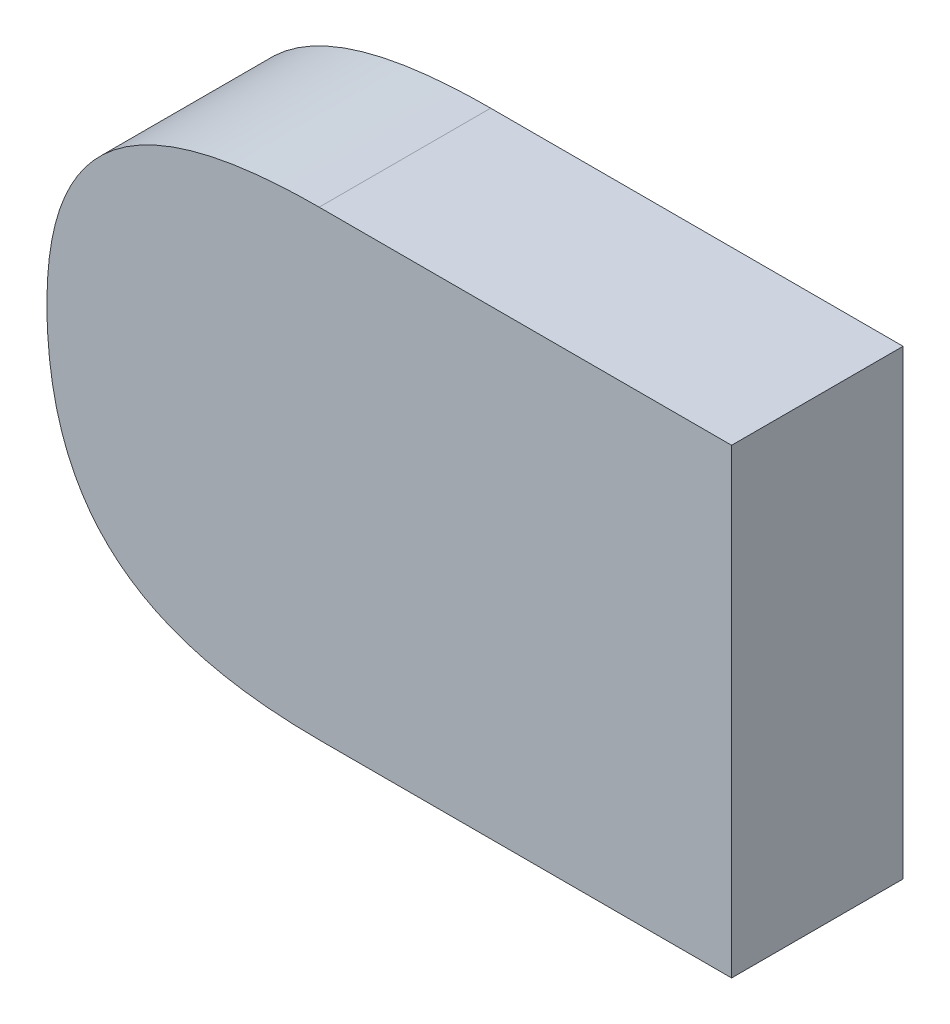
ISO-10303-21;
HEADER;
FILE_DESCRIPTION(('STEP AP214'),'2;1');
FILE_NAME('part.step','',(''),(''),'','','');
FILE_SCHEMA(('AUTOMOTIVE_DESIGN { 1 0 10303 214 1 1 1 1 }'));
ENDSEC;
DATA;
#1=APPLICATION_CONTEXT('core data for automotive mechanical design processes');
#2=APPLICATION_PROTOCOL_DEFINITION('international standard','automotive_design',2000,#1);
#3=PRODUCT_CONTEXT('',#1,'mechanical');
#4=PRODUCT('Part','Part','',(#3));
#5=PRODUCT_RELATED_PRODUCT_CATEGORY('part','',(#4));
#6=PRODUCT_DEFINITION_FORMATION('','',#4);
#7=PRODUCT_DEFINITION_CONTEXT('part definition',#1,'design');
#8=PRODUCT_DEFINITION('design','',#6,#7);
#9=PRODUCT_DEFINITION_SHAPE('','',#8);
#10=(LENGTH_UNIT() NAMED_UNIT(*) SI_UNIT(.MILLI.,.METRE.));
#11=(NAMED_UNIT(*) PLANE_ANGLE_UNIT() SI_UNIT($,.RADIAN.));
#12=(NAMED_UNIT(*) SI_UNIT($,.STERADIAN.) SOLID_ANGLE_UNIT());
#13=UNCERTAINTY_MEASURE_WITH_UNIT(LENGTH_MEASURE(1.E-05),#10,'distance_accuracy_value','');
#14=(GEOMETRIC_REPRESENTATION_CONTEXT(3) GLOBAL_UNCERTAINTY_ASSIGNED_CONTEXT((#13)) GLOBAL_UNIT_ASSIGNED_CONTEXT((#10,
#11,#12)) REPRESENTATION_CONTEXT('',''));
#15=CARTESIAN_POINT('',(0.,0.,0.));
#16=DIRECTION('',(0.,0.,1.));
#17=DIRECTION('',(1.,0.,0.));
#18=AXIS2_PLACEMENT_3D('',#15,#16,#17);
#19=CARTESIAN_POINT('',(20.27643797394,0.827911429436,-5.5));
#20=DIRECTION('',(0.,0.,-1.));
#21=DIRECTION('',(-1.,0.,0.));
#22=AXIS2_PLACEMENT_3D('',#19,#20,#21);
#23=PLANE('',#22);
#24=DIRECTION('',(0.,-1.,0.));
#25=VECTOR('',#24,1.);
#26=CARTESIAN_POINT('',(22.18731541969,2.172720249699,-5.5));
#27=LINE('',#26,#25);
#28=CARTESIAN_POINT('',(22.18731541969,2.172720249699,-5.5));
#29=VERTEX_POINT('',#28);
#30=CARTESIAN_POINT('',(22.18731541969,-0.51778603919,-5.5));
#31=VERTEX_POINT('',#30);
#32=EDGE_CURVE('E116',#29,#31,#27,.T.);
#33=ORIENTED_EDGE('',*,*,#32,.F.);
#34=DIRECTION('',(1.,0.,0.));
#35=VECTOR('',#34,1.);
#36=CARTESIAN_POINT('',(19.78230795303,2.172720249699,-5.5));
#37=LINE('',#36,#35);
#38=CARTESIAN_POINT('',(19.78230795303,2.172720249699,-5.5));
#39=VERTEX_POINT('',#38);
#40=EDGE_CURVE('E25',#39,#29,#37,.T.);
#41=ORIENTED_EDGE('',*,*,#40,.F.);
#42=CARTESIAN_POINT('',(18.19457935303,0.89513976081,-5.5));
#43=CARTESIAN_POINT('',(18.19457935303,1.710152383032,-5.5));
#44=CARTESIAN_POINT('',(18.63086104192,2.172720249699,-5.5));
#45=CARTESIAN_POINT('',(19.78230795303,2.172720249699,-5.5));
#46=(BOUNDED_CURVE() B_SPLINE_CURVE(3,(#42,#43,#44,#45),.UNSPECIFIED.,.F.,
.F.) B_SPLINE_CURVE_WITH_KNOTS((4,4),(0.,1.),
.UNSPECIFIED.) CURVE() GEOMETRIC_REPRESENTATION_ITEM() RATIONAL_B_SPLINE_CURVE((1.,1.,1.,1.)) REPRESENTATION_ITEM(''));
#47=CARTESIAN_POINT('',(18.19457935303,0.89513976081,-5.5));
#48=VERTEX_POINT('',#47);
#49=EDGE_CURVE('E95',#48,#39,#46,.T.);
#50=ORIENTED_EDGE('',*,*,#49,.F.);
#51=CARTESIAN_POINT('',(19.79293079747,-0.51778603919,-5.5));
#52=CARTESIAN_POINT('',(18.80192439747,-0.51778603919,-5.5));
#53=CARTESIAN_POINT('',(18.19457935303,-0.176520105856999,-5.5));
#54=CARTESIAN_POINT('',(18.19457935303,0.89513976081,-5.5));
#55=(BOUNDED_CURVE() B_SPLINE_CURVE(3,(#51,#52,#53,#54),.UNSPECIFIED.,.F.,
.F.) B_SPLINE_CURVE_WITH_KNOTS((4,4),(0.,1.),
.UNSPECIFIED.) CURVE() GEOMETRIC_REPRESENTATION_ITEM() RATIONAL_B_SPLINE_CURVE((1.,1.,1.,1.)) REPRESENTATION_ITEM(''));
#56=CARTESIAN_POINT('',(19.79293079747,-0.51778603919,-5.5));
#57=VERTEX_POINT('',#56);
#58=EDGE_CURVE('E102',#57,#48,#55,.T.);
#59=ORIENTED_EDGE('',*,*,#58,.F.);
#60=DIRECTION('',(-1.,0.,0.));
#61=VECTOR('',#60,1.);
#62=CARTESIAN_POINT('',(22.18731541969,-0.51778603919,-5.5));
#63=LINE('',#62,#61);
#64=EDGE_CURVE('E19',#31,#57,#63,.T.);
#65=ORIENTED_EDGE('',*,*,#64,.F.);
#66=EDGE_LOOP('',(#33,#41,#50,#59,#65));
#67=FACE_BOUND('',#66,.T.);
#68=ADVANCED_FACE('F16',(#67),#23,.F.);
#69=CARTESIAN_POINT('',(20.27643797394,0.827911429436,-6.5));
#70=DIRECTION('',(0.,0.,-1.));
#71=DIRECTION('',(-1.,0.,0.));
#72=AXIS2_PLACEMENT_3D('',#69,#70,#71);
#73=PLANE('',#72);
#74=DIRECTION('',(0.,-1.,0.));
#75=VECTOR('',#74,1.);
#76=CARTESIAN_POINT('',(22.18731541969,2.172720249699,-6.5));
#77=LINE('',#76,#75);
#78=CARTESIAN_POINT('',(22.18731541969,2.172720249699,-6.5));
#79=VERTEX_POINT('',#78);
#80=CARTESIAN_POINT('',(22.18731541969,-0.51778603919,-6.5));
#81=VERTEX_POINT('',#80);
#82=EDGE_CURVE('E99',#79,#81,#77,.T.);
#83=ORIENTED_EDGE('',*,*,#82,.T.);
#84=DIRECTION('',(-1.,0.,0.));
#85=VECTOR('',#84,1.);
#86=CARTESIAN_POINT('',(22.18731541969,-0.51778603919,-6.5));
#87=LINE('',#86,#85);
#88=CARTESIAN_POINT('',(19.79293079747,-0.51778603919,-6.5));
#89=VERTEX_POINT('',#88);
#90=EDGE_CURVE('E62',#81,#89,#87,.T.);
#91=ORIENTED_EDGE('',*,*,#90,.T.);
#92=CARTESIAN_POINT('',(19.79293079747,-0.51778603919,-6.5));
#93=CARTESIAN_POINT('',(18.80192439747,-0.51778603919,-6.5));
#94=CARTESIAN_POINT('',(18.19457935303,-0.176520105856999,-6.5));
#95=CARTESIAN_POINT('',(18.19457935303,0.89513976081,-6.5));
#96=(BOUNDED_CURVE() B_SPLINE_CURVE(3,(#92,#93,#94,#95),.UNSPECIFIED.,.F.,
.F.) B_SPLINE_CURVE_WITH_KNOTS((4,4),(0.,1.),
.UNSPECIFIED.) CURVE() GEOMETRIC_REPRESENTATION_ITEM() RATIONAL_B_SPLINE_CURVE((1.,1.,1.,1.)) REPRESENTATION_ITEM(''));
#97=CARTESIAN_POINT('',(18.19457935303,0.89513976081,-6.5));
#98=VERTEX_POINT('',#97);
#99=EDGE_CURVE('E87',#89,#98,#96,.T.);
#100=ORIENTED_EDGE('',*,*,#99,.T.);
#101=CARTESIAN_POINT('',(18.19457935303,0.89513976081,-6.5));
#102=CARTESIAN_POINT('',(18.19457935303,1.710152383032,-6.5));
#103=CARTESIAN_POINT('',(18.63086104192,2.172720249699,-6.5));
#104=CARTESIAN_POINT('',(19.78230795303,2.172720249699,-6.5));
#105=(BOUNDED_CURVE() B_SPLINE_CURVE(3,(#101,#102,#103,#104),.UNSPECIFIED.,.F.,
.F.) B_SPLINE_CURVE_WITH_KNOTS((4,4),(0.,1.),
.UNSPECIFIED.) CURVE() GEOMETRIC_REPRESENTATION_ITEM() RATIONAL_B_SPLINE_CURVE((1.,1.,1.,1.)) REPRESENTATION_ITEM(''));
#106=CARTESIAN_POINT('',(19.78230795303,2.172720249699,-6.5));
#107=VERTEX_POINT('',#106);
#108=EDGE_CURVE('E128',#98,#107,#105,.T.);
#109=ORIENTED_EDGE('',*,*,#108,.T.);
#110=DIRECTION('',(1.,0.,0.));
#111=VECTOR('',#110,1.);
#112=CARTESIAN_POINT('',(19.78230795303,2.172720249699,-6.5));
#113=LINE('',#112,#111);
#114=EDGE_CURVE('E11',#107,#79,#113,.T.);
#115=ORIENTED_EDGE('',*,*,#114,.T.);
#116=EDGE_LOOP('',(#83,#91,#100,#109,#115));
#117=FACE_BOUND('',#116,.T.);
#118=ADVANCED_FACE('F97',(#117),#73,.T.);
#119=CARTESIAN_POINT('',(20.98481168636,2.172720249699,-5.49));
#120=DIRECTION('',(0.,1.,0.));
#121=DIRECTION('',(-1.,0.,0.));
#122=AXIS2_PLACEMENT_3D('',#119,#120,#121);
#123=PLANE('',#122);
#124=DIRECTION('',(0.,0.,1.));
#125=VECTOR('',#124,1.);
#126=CARTESIAN_POINT('',(19.78230795303,2.172720249699,-6.5));
#127=LINE('',#126,#125);
#128=EDGE_CURVE('E131',#107,#39,#127,.T.);
#129=ORIENTED_EDGE('',*,*,#128,.T.);
#130=ORIENTED_EDGE('',*,*,#40,.T.);
#131=DIRECTION('',(0.,0.,1.));
#132=VECTOR('',#131,1.);
#133=CARTESIAN_POINT('',(22.18731541969,2.172720249699,-6.5));
#134=LINE('',#133,#132);
#135=EDGE_CURVE('E119',#79,#29,#134,.T.);
#136=ORIENTED_EDGE('',*,*,#135,.F.);
#137=ORIENTED_EDGE('',*,*,#114,.F.);
#138=EDGE_LOOP('',(#129,#130,#136,#137));
#139=FACE_BOUND('',#138,.T.);
#140=ADVANCED_FACE('F161',(#139),#123,.T.);
#141=CARTESIAN_POINT('',(18.19457935303,0.89513976081,-5.499));
#142=CARTESIAN_POINT('',(18.19457935303,0.89513976081,-6.501));
#143=CARTESIAN_POINT('',(18.19457935303,1.710152383032,-5.499));
#144=CARTESIAN_POINT('',(18.19457935303,1.710152383032,-6.501));
#145=CARTESIAN_POINT('',(18.63086104192,2.172720249699,-5.499));
#146=CARTESIAN_POINT('',(18.63086104192,2.172720249699,-6.501));
#147=CARTESIAN_POINT('',(19.78230795303,2.172720249699,-5.499));
#148=CARTESIAN_POINT('',(19.78230795303,2.172720249699,-6.501));
#149=(BOUNDED_SURFACE() B_SPLINE_SURFACE(3,1,((#141,#142),(#143,#144),(#145,#146),(#147,#148)),
.UNSPECIFIED.,.F.,.F.,.F.) B_SPLINE_SURFACE_WITH_KNOTS((4,4),(2,2),(0.,1.),(-1.001,0.001),
.UNSPECIFIED.) GEOMETRIC_REPRESENTATION_ITEM() RATIONAL_B_SPLINE_SURFACE(((1.,1.),(1.,1.),(1.,
1.),(1.,1.))) REPRESENTATION_ITEM('') SURFACE());
#150=DIRECTION('',(0.,0.,1.));
#151=VECTOR('',#150,1.);
#152=CARTESIAN_POINT('',(18.19457935303,0.89513976081,-6.5));
#153=LINE('',#152,#151);
#154=EDGE_CURVE('E92',#98,#48,#153,.T.);
#155=ORIENTED_EDGE('',*,*,#154,.T.);
#156=ORIENTED_EDGE('',*,*,#49,.T.);
#157=ORIENTED_EDGE('',*,*,#128,.F.);
#158=ORIENTED_EDGE('',*,*,#108,.F.);
#159=EDGE_LOOP('',(#155,#156,#157,#158));
#160=FACE_BOUND('',#159,.T.);
#161=ADVANCED_FACE('F157',(#160),#149,.T.);
#162=CARTESIAN_POINT('',(19.79293079747,-0.51778603919,-5.499));
#163=CARTESIAN_POINT('',(19.79293079747,-0.51778603919,-6.501));
#164=CARTESIAN_POINT('',(18.80192439747,-0.51778603919,-5.499));
#165=CARTESIAN_POINT('',(18.80192439747,-0.51778603919,-6.501));
#166=CARTESIAN_POINT('',(18.19457935303,-0.176520105856999,-5.499));
#167=CARTESIAN_POINT('',(18.19457935303,-0.176520105856999,-6.501));
#168=CARTESIAN_POINT('',(18.19457935303,0.89513976081,-5.499));
#169=CARTESIAN_POINT('',(18.19457935303,0.89513976081,-6.501));
#170=(BOUNDED_SURFACE() B_SPLINE_SURFACE(3,1,((#162,#163),(#164,#165),(#166,#167),(#168,#169)),
.UNSPECIFIED.,.F.,.F.,.F.) B_SPLINE_SURFACE_WITH_KNOTS((4,4),(2,2),(0.,1.),(-1.001,0.001),
.UNSPECIFIED.) GEOMETRIC_REPRESENTATION_ITEM() RATIONAL_B_SPLINE_SURFACE(((1.,1.),(1.,1.),(1.,
1.),(1.,1.))) REPRESENTATION_ITEM('') SURFACE());
#171=DIRECTION('',(0.,0.,1.));
#172=VECTOR('',#171,1.);
#173=CARTESIAN_POINT('',(19.79293079747,-0.51778603919,-6.5));
#174=LINE('',#173,#172);
#175=EDGE_CURVE('E90',#89,#57,#174,.T.);
#176=ORIENTED_EDGE('',*,*,#175,.T.);
#177=ORIENTED_EDGE('',*,*,#58,.T.);
#178=ORIENTED_EDGE('',*,*,#154,.F.);
#179=ORIENTED_EDGE('',*,*,#99,.F.);
#180=EDGE_LOOP('',(#176,#177,#178,#179));
#181=FACE_BOUND('',#180,.T.);
#182=ADVANCED_FACE('F88',(#181),#170,.T.);
#183=CARTESIAN_POINT('',(20.99012310858,-0.51778603919,-5.49));
#184=DIRECTION('',(0.,-1.,0.));
#185=DIRECTION('',(0.,0.,1.));
#186=AXIS2_PLACEMENT_3D('',#183,#184,#185);
#187=PLANE('',#186);
#188=DIRECTION('',(0.,0.,1.));
#189=VECTOR('',#188,1.);
#190=CARTESIAN_POINT('',(22.18731541969,-0.51778603919,-6.5));
#191=LINE('',#190,#189);
#192=EDGE_CURVE('E118',#81,#31,#191,.T.);
#193=ORIENTED_EDGE('',*,*,#192,.T.);
#194=ORIENTED_EDGE('',*,*,#64,.T.);
#195=ORIENTED_EDGE('',*,*,#175,.F.);
#196=ORIENTED_EDGE('',*,*,#90,.F.);
#197=EDGE_LOOP('',(#193,#194,#195,#196));
#198=FACE_BOUND('',#197,.T.);
#199=ADVANCED_FACE('F104',(#198),#187,.T.);
#200=CARTESIAN_POINT('',(22.18731541969,0.8274671052545,-5.49));
#201=DIRECTION('',(1.,0.,0.));
#202=DIRECTION('',(0.,0.,-1.));
#203=AXIS2_PLACEMENT_3D('',#200,#201,#202);
#204=PLANE('',#203);
#205=ORIENTED_EDGE('',*,*,#135,.T.);
#206=ORIENTED_EDGE('',*,*,#32,.T.);
#207=ORIENTED_EDGE('',*,*,#192,.F.);
#208=ORIENTED_EDGE('',*,*,#82,.F.);
#209=EDGE_LOOP('',(#205,#206,#207,#208));
#210=FACE_BOUND('',#209,.T.);
#211=ADVANCED_FACE('F160',(#210),#204,.T.);
#212=CLOSED_SHELL('',(#68,#118,#140,#161,#182,#199,#211));
#213=MANIFOLD_SOLID_BREP('B1',#212);
#214=ADVANCED_BREP_SHAPE_REPRESENTATION('',(#18,#213),#14);
#215=SHAPE_DEFINITION_REPRESENTATION(#9,#214);
ENDSEC;
END-ISO-10303-21;
